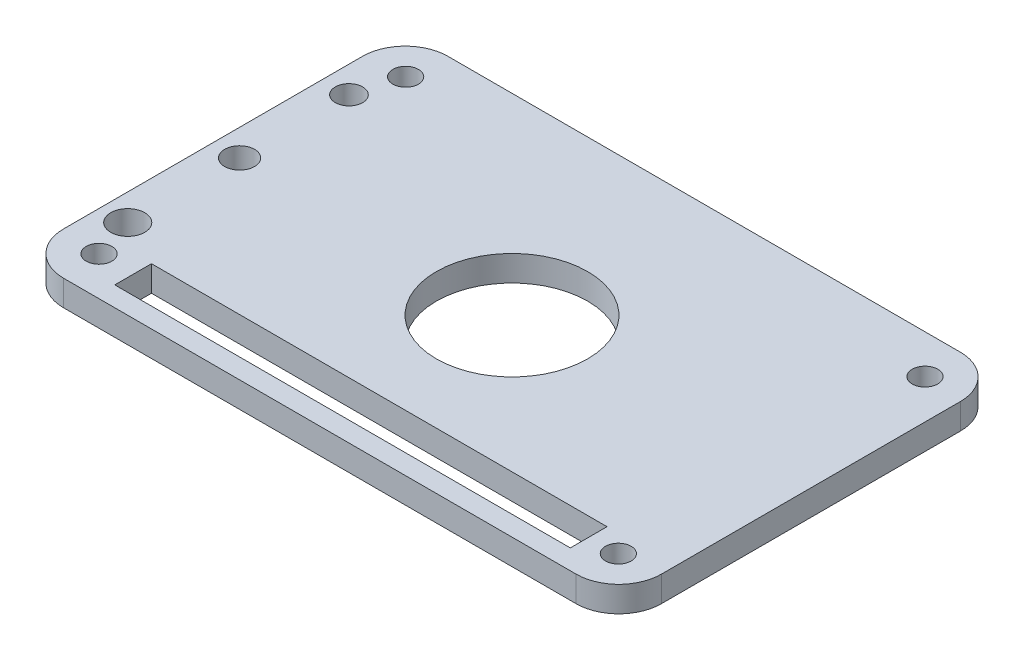
ISO-10303-21;
HEADER;
FILE_DESCRIPTION(('STEP AP214'),'2;1');
FILE_NAME('part.step','',(''),(''),'','','');
FILE_SCHEMA(('AUTOMOTIVE_DESIGN { 1 0 10303 214 1 1 1 1 }'));
ENDSEC;
DATA;
#1=APPLICATION_CONTEXT('core data for automotive mechanical design processes');
#2=APPLICATION_PROTOCOL_DEFINITION('international standard','automotive_design',2000,#1);
#3=PRODUCT_CONTEXT('',#1,'mechanical');
#4=PRODUCT('Part','Part','',(#3));
#5=PRODUCT_RELATED_PRODUCT_CATEGORY('part','',(#4));
#6=PRODUCT_DEFINITION_FORMATION('','',#4);
#7=PRODUCT_DEFINITION_CONTEXT('part definition',#1,'design');
#8=PRODUCT_DEFINITION('design','',#6,#7);
#9=PRODUCT_DEFINITION_SHAPE('','',#8);
#10=(LENGTH_UNIT() NAMED_UNIT(*) SI_UNIT(.MILLI.,.METRE.));
#11=(NAMED_UNIT(*) PLANE_ANGLE_UNIT() SI_UNIT($,.RADIAN.));
#12=(NAMED_UNIT(*) SI_UNIT($,.STERADIAN.) SOLID_ANGLE_UNIT());
#13=UNCERTAINTY_MEASURE_WITH_UNIT(LENGTH_MEASURE(1.E-05),#10,'distance_accuracy_value','');
#14=(GEOMETRIC_REPRESENTATION_CONTEXT(3) GLOBAL_UNCERTAINTY_ASSIGNED_CONTEXT((#13)) GLOBAL_UNIT_ASSIGNED_CONTEXT((#10,
#11,#12)) REPRESENTATION_CONTEXT('',''));
#15=CARTESIAN_POINT('',(0.,0.,0.));
#16=DIRECTION('',(0.,0.,1.));
#17=DIRECTION('',(1.,0.,0.));
#18=AXIS2_PLACEMENT_3D('',#15,#16,#17);
#19=CARTESIAN_POINT('',(-30.,3.,17.5));
#20=DIRECTION('',(0.,1.,0.));
#21=DIRECTION('',(0.,0.,1.));
#22=AXIS2_PLACEMENT_3D('',#19,#20,#21);
#23=PLANE('',#22);
#24=DIRECTION('',(0.,0.,-1.));
#25=VECTOR('',#24,1.);
#26=CARTESIAN_POINT('',(27.006855362046,3.,15.8797292003091));
#27=LINE('',#26,#25);
#28=CARTESIAN_POINT('',(27.006855362046,3.,20.179703378065));
#29=VERTEX_POINT('',#28);
#30=CARTESIAN_POINT('',(27.006855362046,3.,15.8797292003091));
#31=VERTEX_POINT('',#30);
#32=EDGE_CURVE('E62',#29,#31,#27,.T.);
#33=ORIENTED_EDGE('',*,*,#32,.F.);
#34=DIRECTION('',(1.,0.,0.));
#35=VECTOR('',#34,1.);
#36=CARTESIAN_POINT('',(27.006855362046,3.,20.179703378065));
#37=LINE('',#36,#35);
#38=CARTESIAN_POINT('',(-26.3279120708214,3.,20.179703378065));
#39=VERTEX_POINT('',#38);
#40=EDGE_CURVE('E146',#39,#29,#37,.T.);
#41=ORIENTED_EDGE('',*,*,#40,.F.);
#42=DIRECTION('',(0.,0.,1.));
#43=VECTOR('',#42,1.);
#44=CARTESIAN_POINT('',(-26.3279120708214,3.,15.8797292003091));
#45=LINE('',#44,#43);
#46=CARTESIAN_POINT('',(-26.3279120708214,3.,15.8797292003091));
#47=VERTEX_POINT('',#46);
#48=EDGE_CURVE('E151',#47,#39,#45,.T.);
#49=ORIENTED_EDGE('',*,*,#48,.F.);
#50=DIRECTION('',(-1.,0.,0.));
#51=VECTOR('',#50,1.);
#52=CARTESIAN_POINT('',(27.006855362046,3.,15.8797292003091));
#53=LINE('',#52,#51);
#54=EDGE_CURVE('E156',#31,#47,#53,.T.);
#55=ORIENTED_EDGE('',*,*,#54,.F.);
#56=EDGE_LOOP('',(#33,#41,#49,#55));
#57=FACE_BOUND('',#56,.T.);
#58=CARTESIAN_POINT('',(-31.8929936177881,3.,-12.8051895817142));
#59=DIRECTION('',(0.,1.,0.));
#60=DIRECTION('',(0.,0.,1.));
#61=AXIS2_PLACEMENT_3D('',#58,#59,#60);
#62=CIRCLE('',#61,1.60028468422017);
#63=CARTESIAN_POINT('',(-31.8929936177881,3.,-11.204904897494));
#64=VERTEX_POINT('',#63);
#65=EDGE_CURVE('E143',#64,#64,#62,.T.);
#66=ORIENTED_EDGE('',*,*,#65,.F.);
#67=EDGE_LOOP('',(#66));
#68=FACE_BOUND('',#67,.T.);
#69=CARTESIAN_POINT('',(-31.8929936177881,3.,0.));
#70=DIRECTION('',(0.,1.,0.));
#71=DIRECTION('',(0.,0.,1.));
#72=AXIS2_PLACEMENT_3D('',#69,#70,#71);
#73=CIRCLE('',#72,1.75018118663529);
#74=CARTESIAN_POINT('',(-31.8929936177881,3.,1.75018118663529));
#75=VERTEX_POINT('',#74);
#76=EDGE_CURVE('E178',#75,#75,#73,.T.);
#77=ORIENTED_EDGE('',*,*,#76,.F.);
#78=EDGE_LOOP('',(#77));
#79=FACE_BOUND('',#78,.T.);
#80=CARTESIAN_POINT('',(-31.8929936177881,3.,13.0948104182858));
#81=DIRECTION('',(0.,1.,0.));
#82=DIRECTION('',(0.,0.,1.));
#83=AXIS2_PLACEMENT_3D('',#80,#81,#82);
#84=CIRCLE('',#83,1.9930523365173);
#85=CARTESIAN_POINT('',(-31.8929936177881,3.,15.0878627548031));
#86=VERTEX_POINT('',#85);
#87=EDGE_CURVE('E386',#86,#86,#84,.T.);
#88=ORIENTED_EDGE('',*,*,#87,.F.);
#89=EDGE_LOOP('',(#88));
#90=FACE_BOUND('',#89,.T.);
#91=CARTESIAN_POINT('',(0.,3.,0.));
#92=DIRECTION('',(0.,1.,0.));
#93=DIRECTION('',(0.,0.,1.));
#94=AXIS2_PLACEMENT_3D('',#91,#92,#93);
#95=CIRCLE('',#94,8.8562741855178);
#96=CARTESIAN_POINT('',(0.,3.,8.8562741855178));
#97=VERTEX_POINT('',#96);
#98=EDGE_CURVE('E157',#97,#97,#95,.T.);
#99=ORIENTED_EDGE('',*,*,#98,.F.);
#100=EDGE_LOOP('',(#99));
#101=FACE_BOUND('',#100,.T.);
#102=CARTESIAN_POINT('',(30.4,3.,-17.95));
#103=DIRECTION('',(0.,1.,0.));
#104=DIRECTION('',(0.,0.,1.));
#105=AXIS2_PLACEMENT_3D('',#102,#103,#104);
#106=CIRCLE('',#105,1.5);
#107=CARTESIAN_POINT('',(30.4,3.,-16.45));
#108=VERTEX_POINT('',#107);
#109=EDGE_CURVE('E188',#108,#108,#106,.T.);
#110=ORIENTED_EDGE('',*,*,#109,.F.);
#111=EDGE_LOOP('',(#110));
#112=FACE_BOUND('',#111,.T.);
#113=CARTESIAN_POINT('',(-30.4,3.,17.95));
#114=DIRECTION('',(0.,1.,0.));
#115=DIRECTION('',(0.,0.,1.));
#116=AXIS2_PLACEMENT_3D('',#113,#114,#115);
#117=CIRCLE('',#116,1.5);
#118=CARTESIAN_POINT('',(-30.4,3.,19.45));
#119=VERTEX_POINT('',#118);
#120=EDGE_CURVE('E200',#119,#119,#117,.T.);
#121=ORIENTED_EDGE('',*,*,#120,.F.);
#122=EDGE_LOOP('',(#121));
#123=FACE_BOUND('',#122,.T.);
#124=CARTESIAN_POINT('',(-30.,3.,17.5));
#125=DIRECTION('',(0.,1.,0.));
#126=DIRECTION('',(0.,0.,1.));
#127=AXIS2_PLACEMENT_3D('',#124,#125,#126);
#128=CIRCLE('',#127,5.);
#129=CARTESIAN_POINT('',(-35.,3.,17.5));
#130=VERTEX_POINT('',#129);
#131=CARTESIAN_POINT('',(-30.,3.,22.5));
#132=VERTEX_POINT('',#131);
#133=EDGE_CURVE('E206',#130,#132,#128,.T.);
#134=ORIENTED_EDGE('',*,*,#133,.T.);
#135=DIRECTION('',(1.,0.,0.));
#136=VECTOR('',#135,1.);
#137=CARTESIAN_POINT('',(-30.,3.,22.5));
#138=LINE('',#137,#136);
#139=CARTESIAN_POINT('',(29.9999999999999,3.,22.5));
#140=VERTEX_POINT('',#139);
#141=EDGE_CURVE('E209',#132,#140,#138,.T.);
#142=ORIENTED_EDGE('',*,*,#141,.T.);
#143=CARTESIAN_POINT('',(30.,3.,17.5));
#144=DIRECTION('',(0.,1.,0.));
#145=DIRECTION('',(0.,0.,1.));
#146=AXIS2_PLACEMENT_3D('',#143,#144,#145);
#147=CIRCLE('',#146,5.);
#148=CARTESIAN_POINT('',(35.,3.,17.5));
#149=VERTEX_POINT('',#148);
#150=EDGE_CURVE('E212',#140,#149,#147,.T.);
#151=ORIENTED_EDGE('',*,*,#150,.T.);
#152=DIRECTION('',(0.,0.,-1.));
#153=VECTOR('',#152,1.);
#154=CARTESIAN_POINT('',(35.,3.,-17.5));
#155=LINE('',#154,#153);
#156=CARTESIAN_POINT('',(35.,3.,-17.5));
#157=VERTEX_POINT('',#156);
#158=EDGE_CURVE('E214',#149,#157,#155,.T.);
#159=ORIENTED_EDGE('',*,*,#158,.T.);
#160=CARTESIAN_POINT('',(30.,3.,-17.5));
#161=DIRECTION('',(0.,1.,0.));
#162=DIRECTION('',(0.,0.,-1.));
#163=AXIS2_PLACEMENT_3D('',#160,#161,#162);
#164=CIRCLE('',#163,5.);
#165=CARTESIAN_POINT('',(29.9999999999999,3.,-22.5));
#166=VERTEX_POINT('',#165);
#167=EDGE_CURVE('E216',#157,#166,#164,.T.);
#168=ORIENTED_EDGE('',*,*,#167,.T.);
#169=DIRECTION('',(-1.,0.,0.));
#170=VECTOR('',#169,1.);
#171=CARTESIAN_POINT('',(-30.,3.,-22.5));
#172=LINE('',#171,#170);
#173=CARTESIAN_POINT('',(-30.,3.,-22.5));
#174=VERTEX_POINT('',#173);
#175=EDGE_CURVE('E218',#166,#174,#172,.T.);
#176=ORIENTED_EDGE('',*,*,#175,.T.);
#177=CARTESIAN_POINT('',(-30.,3.,-17.5));
#178=DIRECTION('',(0.,1.,0.));
#179=DIRECTION('',(0.,0.,1.));
#180=AXIS2_PLACEMENT_3D('',#177,#178,#179);
#181=CIRCLE('',#180,5.);
#182=CARTESIAN_POINT('',(-35.,3.,-17.5));
#183=VERTEX_POINT('',#182);
#184=EDGE_CURVE('E220',#174,#183,#181,.T.);
#185=ORIENTED_EDGE('',*,*,#184,.T.);
#186=DIRECTION('',(0.,0.,1.));
#187=VECTOR('',#186,1.);
#188=CARTESIAN_POINT('',(-35.,3.,-17.5));
#189=LINE('',#188,#187);
#190=EDGE_CURVE('E222',#183,#130,#189,.T.);
#191=ORIENTED_EDGE('',*,*,#190,.T.);
#192=EDGE_LOOP('',(#134,#142,#151,#159,#168,#176,#185,#191));
#193=FACE_BOUND('',#192,.T.);
#194=CARTESIAN_POINT('',(30.4,3.,17.95));
#195=DIRECTION('',(0.,1.,0.));
#196=DIRECTION('',(0.,0.,-1.));
#197=AXIS2_PLACEMENT_3D('',#194,#195,#196);
#198=CIRCLE('',#197,1.50000000000001);
#199=CARTESIAN_POINT('',(30.4,3.,16.45));
#200=VERTEX_POINT('',#199);
#201=EDGE_CURVE('E194',#200,#200,#198,.T.);
#202=ORIENTED_EDGE('',*,*,#201,.F.);
#203=EDGE_LOOP('',(#202));
#204=FACE_BOUND('',#203,.T.);
#205=CARTESIAN_POINT('',(-30.4,3.,-17.95));
#206=DIRECTION('',(0.,1.,0.));
#207=DIRECTION('',(0.,0.,-1.));
#208=AXIS2_PLACEMENT_3D('',#205,#206,#207);
#209=CIRCLE('',#208,1.5);
#210=CARTESIAN_POINT('',(-30.4,3.,-19.45));
#211=VERTEX_POINT('',#210);
#212=EDGE_CURVE('E182',#211,#211,#209,.T.);
#213=ORIENTED_EDGE('',*,*,#212,.F.);
#214=EDGE_LOOP('',(#213));
#215=FACE_BOUND('',#214,.T.);
#216=ADVANCED_FACE('F47',(#57,#68,#79,#90,#101,#112,#123,#193,#204,#215),#23,.T.);
#217=CARTESIAN_POINT('',(-30.,0.,17.5));
#218=DIRECTION('',(0.,1.,0.));
#219=DIRECTION('',(0.,0.,1.));
#220=AXIS2_PLACEMENT_3D('',#217,#218,#219);
#221=PLANE('',#220);
#222=DIRECTION('',(1.,0.,0.));
#223=VECTOR('',#222,1.);
#224=CARTESIAN_POINT('',(27.006855362046,0.,20.179703378065));
#225=LINE('',#224,#223);
#226=CARTESIAN_POINT('',(-26.3279120708214,0.,20.179703378065));
#227=VERTEX_POINT('',#226);
#228=CARTESIAN_POINT('',(27.006855362046,0.,20.179703378065));
#229=VERTEX_POINT('',#228);
#230=EDGE_CURVE('E165',#227,#229,#225,.T.);
#231=ORIENTED_EDGE('',*,*,#230,.T.);
#232=DIRECTION('',(0.,0.,-1.));
#233=VECTOR('',#232,1.);
#234=CARTESIAN_POINT('',(27.006855362046,0.,15.8797292003091));
#235=LINE('',#234,#233);
#236=CARTESIAN_POINT('',(27.006855362046,0.,15.8797292003091));
#237=VERTEX_POINT('',#236);
#238=EDGE_CURVE('E138',#229,#237,#235,.T.);
#239=ORIENTED_EDGE('',*,*,#238,.T.);
#240=DIRECTION('',(-1.,0.,0.));
#241=VECTOR('',#240,1.);
#242=CARTESIAN_POINT('',(27.006855362046,0.,15.8797292003091));
#243=LINE('',#242,#241);
#244=CARTESIAN_POINT('',(-26.3279120708214,0.,15.8797292003091));
#245=VERTEX_POINT('',#244);
#246=EDGE_CURVE('E169',#237,#245,#243,.T.);
#247=ORIENTED_EDGE('',*,*,#246,.T.);
#248=DIRECTION('',(0.,0.,1.));
#249=VECTOR('',#248,1.);
#250=CARTESIAN_POINT('',(-26.3279120708214,0.,15.8797292003091));
#251=LINE('',#250,#249);
#252=EDGE_CURVE('E70',#245,#227,#251,.T.);
#253=ORIENTED_EDGE('',*,*,#252,.T.);
#254=EDGE_LOOP('',(#231,#239,#247,#253));
#255=FACE_BOUND('',#254,.T.);
#256=CARTESIAN_POINT('',(-31.8929936177881,0.,-12.8051895817142));
#257=DIRECTION('',(0.,1.,0.));
#258=DIRECTION('',(0.,0.,1.));
#259=AXIS2_PLACEMENT_3D('',#256,#257,#258);
#260=CIRCLE('',#259,1.60028468422017);
#261=CARTESIAN_POINT('',(-31.8929936177881,0.,-11.204904897494));
#262=VERTEX_POINT('',#261);
#263=EDGE_CURVE('E175',#262,#262,#260,.T.);
#264=ORIENTED_EDGE('',*,*,#263,.T.);
#265=EDGE_LOOP('',(#264));
#266=FACE_BOUND('',#265,.T.);
#267=CARTESIAN_POINT('',(-31.8929936177881,0.,0.));
#268=DIRECTION('',(0.,1.,0.));
#269=DIRECTION('',(0.,0.,1.));
#270=AXIS2_PLACEMENT_3D('',#267,#268,#269);
#271=CIRCLE('',#270,1.75018118663529);
#272=CARTESIAN_POINT('',(-31.8929936177881,0.,1.75018118663529));
#273=VERTEX_POINT('',#272);
#274=EDGE_CURVE('E381',#273,#273,#271,.T.);
#275=ORIENTED_EDGE('',*,*,#274,.T.);
#276=EDGE_LOOP('',(#275));
#277=FACE_BOUND('',#276,.T.);
#278=CARTESIAN_POINT('',(-31.8929936177881,0.,13.0948104182858));
#279=DIRECTION('',(0.,1.,0.));
#280=DIRECTION('',(0.,0.,1.));
#281=AXIS2_PLACEMENT_3D('',#278,#279,#280);
#282=CIRCLE('',#281,1.9930523365173);
#283=CARTESIAN_POINT('',(-31.8929936177881,0.,15.0878627548031));
#284=VERTEX_POINT('',#283);
#285=EDGE_CURVE('E391',#284,#284,#282,.T.);
#286=ORIENTED_EDGE('',*,*,#285,.T.);
#287=EDGE_LOOP('',(#286));
#288=FACE_BOUND('',#287,.T.);
#289=CARTESIAN_POINT('',(0.,0.,0.));
#290=DIRECTION('',(0.,1.,0.));
#291=DIRECTION('',(0.,0.,1.));
#292=AXIS2_PLACEMENT_3D('',#289,#290,#291);
#293=CIRCLE('',#292,8.8562741855178);
#294=CARTESIAN_POINT('',(0.,0.,8.8562741855178));
#295=VERTEX_POINT('',#294);
#296=EDGE_CURVE('E160',#295,#295,#293,.T.);
#297=ORIENTED_EDGE('',*,*,#296,.T.);
#298=EDGE_LOOP('',(#297));
#299=FACE_BOUND('',#298,.T.);
#300=CARTESIAN_POINT('',(-30.,0.,17.5));
#301=DIRECTION('',(0.,1.,0.));
#302=DIRECTION('',(0.,0.,1.));
#303=AXIS2_PLACEMENT_3D('',#300,#301,#302);
#304=CIRCLE('',#303,5.);
#305=CARTESIAN_POINT('',(-35.,0.,17.5));
#306=VERTEX_POINT('',#305);
#307=CARTESIAN_POINT('',(-30.,0.,22.5));
#308=VERTEX_POINT('',#307);
#309=EDGE_CURVE('E203',#306,#308,#304,.T.);
#310=ORIENTED_EDGE('',*,*,#309,.F.);
#311=DIRECTION('',(0.,0.,1.));
#312=VECTOR('',#311,1.);
#313=CARTESIAN_POINT('',(-35.,0.,-17.5));
#314=LINE('',#313,#312);
#315=CARTESIAN_POINT('',(-35.,0.,-17.5));
#316=VERTEX_POINT('',#315);
#317=EDGE_CURVE('E210',#316,#306,#314,.T.);
#318=ORIENTED_EDGE('',*,*,#317,.F.);
#319=CARTESIAN_POINT('',(-30.,0.,-17.5));
#320=DIRECTION('',(0.,1.,0.));
#321=DIRECTION('',(0.,0.,1.));
#322=AXIS2_PLACEMENT_3D('',#319,#320,#321);
#323=CIRCLE('',#322,5.);
#324=CARTESIAN_POINT('',(-30.,0.,-22.5));
#325=VERTEX_POINT('',#324);
#326=EDGE_CURVE('E237',#325,#316,#323,.T.);
#327=ORIENTED_EDGE('',*,*,#326,.F.);
#328=DIRECTION('',(-1.,0.,0.));
#329=VECTOR('',#328,1.);
#330=CARTESIAN_POINT('',(-30.,0.,-22.5));
#331=LINE('',#330,#329);
#332=CARTESIAN_POINT('',(29.9999999999999,0.,-22.5));
#333=VERTEX_POINT('',#332);
#334=EDGE_CURVE('E235',#333,#325,#331,.T.);
#335=ORIENTED_EDGE('',*,*,#334,.F.);
#336=CARTESIAN_POINT('',(30.,0.,-17.5));
#337=DIRECTION('',(0.,1.,0.));
#338=DIRECTION('',(0.,0.,-1.));
#339=AXIS2_PLACEMENT_3D('',#336,#337,#338);
#340=CIRCLE('',#339,5.);
#341=CARTESIAN_POINT('',(35.,0.,-17.5));
#342=VERTEX_POINT('',#341);
#343=EDGE_CURVE('E233',#342,#333,#340,.T.);
#344=ORIENTED_EDGE('',*,*,#343,.F.);
#345=DIRECTION('',(0.,0.,-1.));
#346=VECTOR('',#345,1.);
#347=CARTESIAN_POINT('',(35.,0.,-17.5));
#348=LINE('',#347,#346);
#349=CARTESIAN_POINT('',(35.,0.,17.5));
#350=VERTEX_POINT('',#349);
#351=EDGE_CURVE('E231',#350,#342,#348,.T.);
#352=ORIENTED_EDGE('',*,*,#351,.F.);
#353=CARTESIAN_POINT('',(30.,0.,17.5));
#354=DIRECTION('',(0.,1.,0.));
#355=DIRECTION('',(0.,0.,1.));
#356=AXIS2_PLACEMENT_3D('',#353,#354,#355);
#357=CIRCLE('',#356,5.);
#358=CARTESIAN_POINT('',(29.9999999999999,0.,22.5));
#359=VERTEX_POINT('',#358);
#360=EDGE_CURVE('E229',#359,#350,#357,.T.);
#361=ORIENTED_EDGE('',*,*,#360,.F.);
#362=DIRECTION('',(1.,0.,0.));
#363=VECTOR('',#362,1.);
#364=CARTESIAN_POINT('',(-30.,0.,22.5));
#365=LINE('',#364,#363);
#366=EDGE_CURVE('E227',#308,#359,#365,.T.);
#367=ORIENTED_EDGE('',*,*,#366,.F.);
#368=EDGE_LOOP('',(#310,#318,#327,#335,#344,#352,#361,#367));
#369=FACE_BOUND('',#368,.T.);
#370=CARTESIAN_POINT('',(-30.4,0.,17.95));
#371=DIRECTION('',(0.,1.,0.));
#372=DIRECTION('',(0.,0.,1.));
#373=AXIS2_PLACEMENT_3D('',#370,#371,#372);
#374=CIRCLE('',#373,1.5);
#375=CARTESIAN_POINT('',(-30.4,0.,19.45));
#376=VERTEX_POINT('',#375);
#377=EDGE_CURVE('E197',#376,#376,#374,.T.);
#378=ORIENTED_EDGE('',*,*,#377,.T.);
#379=EDGE_LOOP('',(#378));
#380=FACE_BOUND('',#379,.T.);
#381=CARTESIAN_POINT('',(30.4,0.,17.95));
#382=DIRECTION('',(0.,1.,0.));
#383=DIRECTION('',(0.,0.,-1.));
#384=AXIS2_PLACEMENT_3D('',#381,#382,#383);
#385=CIRCLE('',#384,1.50000000000001);
#386=CARTESIAN_POINT('',(30.4,0.,16.45));
#387=VERTEX_POINT('',#386);
#388=EDGE_CURVE('E191',#387,#387,#385,.T.);
#389=ORIENTED_EDGE('',*,*,#388,.T.);
#390=EDGE_LOOP('',(#389));
#391=FACE_BOUND('',#390,.T.);
#392=CARTESIAN_POINT('',(30.4,0.,-17.95));
#393=DIRECTION('',(0.,1.,0.));
#394=DIRECTION('',(0.,0.,1.));
#395=AXIS2_PLACEMENT_3D('',#392,#393,#394);
#396=CIRCLE('',#395,1.5);
#397=CARTESIAN_POINT('',(30.4,0.,-16.45));
#398=VERTEX_POINT('',#397);
#399=EDGE_CURVE('E185',#398,#398,#396,.T.);
#400=ORIENTED_EDGE('',*,*,#399,.T.);
#401=EDGE_LOOP('',(#400));
#402=FACE_BOUND('',#401,.T.);
#403=CARTESIAN_POINT('',(-30.4,0.,-17.95));
#404=DIRECTION('',(0.,1.,0.));
#405=DIRECTION('',(0.,0.,-1.));
#406=AXIS2_PLACEMENT_3D('',#403,#404,#405);
#407=CIRCLE('',#406,1.5);
#408=CARTESIAN_POINT('',(-30.4,0.,-19.45));
#409=VERTEX_POINT('',#408);
#410=EDGE_CURVE('E180',#409,#409,#407,.T.);
#411=ORIENTED_EDGE('',*,*,#410,.T.);
#412=EDGE_LOOP('',(#411));
#413=FACE_BOUND('',#412,.T.);
#414=ADVANCED_FACE('F267',(#255,#266,#277,#288,#299,#369,#380,#391,#402,#413),#221,.F.);
#415=CARTESIAN_POINT('',(-30.,3.,17.5));
#416=DIRECTION('',(0.,-1.,0.));
#417=DIRECTION('',(0.,0.,-1.));
#418=AXIS2_PLACEMENT_3D('',#415,#416,#417);
#419=CYLINDRICAL_SURFACE('',#418,5.);
#420=ORIENTED_EDGE('',*,*,#309,.T.);
#421=DIRECTION('',(0.,-1.,0.));
#422=VECTOR('',#421,1.);
#423=CARTESIAN_POINT('',(-30.,3.,22.5));
#424=LINE('',#423,#422);
#425=EDGE_CURVE('E11',#132,#308,#424,.T.);
#426=ORIENTED_EDGE('',*,*,#425,.F.);
#427=ORIENTED_EDGE('',*,*,#133,.F.);
#428=DIRECTION('',(0.,-1.,0.));
#429=VECTOR('',#428,1.);
#430=CARTESIAN_POINT('',(-35.,3.,17.5));
#431=LINE('',#430,#429);
#432=EDGE_CURVE('E224',#130,#306,#431,.T.);
#433=ORIENTED_EDGE('',*,*,#432,.T.);
#434=EDGE_LOOP('',(#420,#426,#427,#433));
#435=FACE_BOUND('',#434,.T.);
#436=ADVANCED_FACE('F49',(#435),#419,.T.);
#437=CARTESIAN_POINT('',(-30.,3.,22.5));
#438=DIRECTION('',(0.,0.,-1.));
#439=DIRECTION('',(-1.,0.,0.));
#440=AXIS2_PLACEMENT_3D('',#437,#438,#439);
#441=PLANE('',#440);
#442=ORIENTED_EDGE('',*,*,#366,.T.);
#443=DIRECTION('',(0.,-1.,0.));
#444=VECTOR('',#443,1.);
#445=CARTESIAN_POINT('',(29.9999999999999,3.,22.5));
#446=LINE('',#445,#444);
#447=EDGE_CURVE('E55',#140,#359,#446,.T.);
#448=ORIENTED_EDGE('',*,*,#447,.F.);
#449=ORIENTED_EDGE('',*,*,#141,.F.);
#450=ORIENTED_EDGE('',*,*,#425,.T.);
#451=EDGE_LOOP('',(#442,#448,#449,#450));
#452=FACE_BOUND('',#451,.T.);
#453=ADVANCED_FACE('F285',(#452),#441,.F.);
#454=CARTESIAN_POINT('',(30.,3.,17.5));
#455=DIRECTION('',(0.,-1.,0.));
#456=DIRECTION('',(0.,0.,-1.));
#457=AXIS2_PLACEMENT_3D('',#454,#455,#456);
#458=CYLINDRICAL_SURFACE('',#457,5.);
#459=ORIENTED_EDGE('',*,*,#360,.T.);
#460=DIRECTION('',(0.,-1.,0.));
#461=VECTOR('',#460,1.);
#462=CARTESIAN_POINT('',(35.,3.,17.5));
#463=LINE('',#462,#461);
#464=EDGE_CURVE('E254',#149,#350,#463,.T.);
#465=ORIENTED_EDGE('',*,*,#464,.F.);
#466=ORIENTED_EDGE('',*,*,#150,.F.);
#467=ORIENTED_EDGE('',*,*,#447,.T.);
#468=EDGE_LOOP('',(#459,#465,#466,#467));
#469=FACE_BOUND('',#468,.T.);
#470=ADVANCED_FACE('F261',(#469),#458,.T.);
#471=CARTESIAN_POINT('',(35.,3.,-17.5));
#472=DIRECTION('',(-1.,0.,0.));
#473=DIRECTION('',(0.,0.,1.));
#474=AXIS2_PLACEMENT_3D('',#471,#472,#473);
#475=PLANE('',#474);
#476=ORIENTED_EDGE('',*,*,#351,.T.);
#477=DIRECTION('',(0.,-1.,0.));
#478=VECTOR('',#477,1.);
#479=CARTESIAN_POINT('',(35.,3.,-17.5));
#480=LINE('',#479,#478);
#481=EDGE_CURVE('E251',#157,#342,#480,.T.);
#482=ORIENTED_EDGE('',*,*,#481,.F.);
#483=ORIENTED_EDGE('',*,*,#158,.F.);
#484=ORIENTED_EDGE('',*,*,#464,.T.);
#485=EDGE_LOOP('',(#476,#482,#483,#484));
#486=FACE_BOUND('',#485,.T.);
#487=ADVANCED_FACE('F273',(#486),#475,.F.);
#488=CARTESIAN_POINT('',(30.,3.,-17.5));
#489=DIRECTION('',(0.,-1.,0.));
#490=DIRECTION('',(0.,0.,-1.));
#491=AXIS2_PLACEMENT_3D('',#488,#489,#490);
#492=CYLINDRICAL_SURFACE('',#491,5.);
#493=ORIENTED_EDGE('',*,*,#343,.T.);
#494=DIRECTION('',(0.,-1.,0.));
#495=VECTOR('',#494,1.);
#496=CARTESIAN_POINT('',(29.9999999999999,3.,-22.5));
#497=LINE('',#496,#495);
#498=EDGE_CURVE('E248',#166,#333,#497,.T.);
#499=ORIENTED_EDGE('',*,*,#498,.F.);
#500=ORIENTED_EDGE('',*,*,#167,.F.);
#501=ORIENTED_EDGE('',*,*,#481,.T.);
#502=EDGE_LOOP('',(#493,#499,#500,#501));
#503=FACE_BOUND('',#502,.T.);
#504=ADVANCED_FACE('F277',(#503),#492,.T.);
#505=CARTESIAN_POINT('',(-30.,3.,-22.5));
#506=DIRECTION('',(0.,0.,1.));
#507=DIRECTION('',(1.,0.,0.));
#508=AXIS2_PLACEMENT_3D('',#505,#506,#507);
#509=PLANE('',#508);
#510=ORIENTED_EDGE('',*,*,#334,.T.);
#511=DIRECTION('',(0.,-1.,0.));
#512=VECTOR('',#511,1.);
#513=CARTESIAN_POINT('',(-30.,3.,-22.5));
#514=LINE('',#513,#512);
#515=EDGE_CURVE('E245',#174,#325,#514,.T.);
#516=ORIENTED_EDGE('',*,*,#515,.F.);
#517=ORIENTED_EDGE('',*,*,#175,.F.);
#518=ORIENTED_EDGE('',*,*,#498,.T.);
#519=EDGE_LOOP('',(#510,#516,#517,#518));
#520=FACE_BOUND('',#519,.T.);
#521=ADVANCED_FACE('F298',(#520),#509,.F.);
#522=CARTESIAN_POINT('',(-30.,3.,-17.5));
#523=DIRECTION('',(0.,-1.,0.));
#524=DIRECTION('',(0.,0.,-1.));
#525=AXIS2_PLACEMENT_3D('',#522,#523,#524);
#526=CYLINDRICAL_SURFACE('',#525,5.);
#527=ORIENTED_EDGE('',*,*,#326,.T.);
#528=DIRECTION('',(0.,-1.,0.));
#529=VECTOR('',#528,1.);
#530=CARTESIAN_POINT('',(-35.,3.,-17.5));
#531=LINE('',#530,#529);
#532=EDGE_CURVE('E242',#183,#316,#531,.T.);
#533=ORIENTED_EDGE('',*,*,#532,.F.);
#534=ORIENTED_EDGE('',*,*,#184,.F.);
#535=ORIENTED_EDGE('',*,*,#515,.T.);
#536=EDGE_LOOP('',(#527,#533,#534,#535));
#537=FACE_BOUND('',#536,.T.);
#538=ADVANCED_FACE('F296',(#537),#526,.T.);
#539=CARTESIAN_POINT('',(-35.,3.,-17.5));
#540=DIRECTION('',(1.,0.,0.));
#541=DIRECTION('',(0.,0.,-1.));
#542=AXIS2_PLACEMENT_3D('',#539,#540,#541);
#543=PLANE('',#542);
#544=ORIENTED_EDGE('',*,*,#317,.T.);
#545=ORIENTED_EDGE('',*,*,#432,.F.);
#546=ORIENTED_EDGE('',*,*,#190,.F.);
#547=ORIENTED_EDGE('',*,*,#532,.T.);
#548=EDGE_LOOP('',(#544,#545,#546,#547));
#549=FACE_BOUND('',#548,.T.);
#550=ADVANCED_FACE('F291',(#549),#543,.F.);
#551=CARTESIAN_POINT('',(-30.4,3.,17.95));
#552=DIRECTION('',(0.,-1.,0.));
#553=DIRECTION('',(0.,0.,-1.));
#554=AXIS2_PLACEMENT_3D('',#551,#552,#553);
#555=CYLINDRICAL_SURFACE('',#554,1.5);
#556=ORIENTED_EDGE('',*,*,#120,.T.);
#557=EDGE_LOOP('',(#556));
#558=FACE_BOUND('',#557,.T.);
#559=ORIENTED_EDGE('',*,*,#377,.F.);
#560=EDGE_LOOP('',(#559));
#561=FACE_BOUND('',#560,.T.);
#562=ADVANCED_FACE('F315',(#558,#561),#555,.F.);
#563=CARTESIAN_POINT('',(30.4,3.,17.95));
#564=DIRECTION('',(0.,-1.,0.));
#565=DIRECTION('',(0.,0.,-1.));
#566=AXIS2_PLACEMENT_3D('',#563,#564,#565);
#567=CYLINDRICAL_SURFACE('',#566,1.50000000000001);
#568=ORIENTED_EDGE('',*,*,#201,.T.);
#569=EDGE_LOOP('',(#568));
#570=FACE_BOUND('',#569,.T.);
#571=ORIENTED_EDGE('',*,*,#388,.F.);
#572=EDGE_LOOP('',(#571));
#573=FACE_BOUND('',#572,.T.);
#574=ADVANCED_FACE('F322',(#570,#573),#567,.F.);
#575=CARTESIAN_POINT('',(30.4,3.,-17.95));
#576=DIRECTION('',(0.,-1.,0.));
#577=DIRECTION('',(0.,0.,-1.));
#578=AXIS2_PLACEMENT_3D('',#575,#576,#577);
#579=CYLINDRICAL_SURFACE('',#578,1.5);
#580=ORIENTED_EDGE('',*,*,#109,.T.);
#581=EDGE_LOOP('',(#580));
#582=FACE_BOUND('',#581,.T.);
#583=ORIENTED_EDGE('',*,*,#399,.F.);
#584=EDGE_LOOP('',(#583));
#585=FACE_BOUND('',#584,.T.);
#586=ADVANCED_FACE('F327',(#582,#585),#579,.F.);
#587=CARTESIAN_POINT('',(-30.4,3.,-17.95));
#588=DIRECTION('',(0.,-1.,0.));
#589=DIRECTION('',(0.,0.,-1.));
#590=AXIS2_PLACEMENT_3D('',#587,#588,#589);
#591=CYLINDRICAL_SURFACE('',#590,1.5);
#592=ORIENTED_EDGE('',*,*,#212,.T.);
#593=EDGE_LOOP('',(#592));
#594=FACE_BOUND('',#593,.T.);
#595=ORIENTED_EDGE('',*,*,#410,.F.);
#596=EDGE_LOOP('',(#595));
#597=FACE_BOUND('',#596,.T.);
#598=ADVANCED_FACE('F339',(#594,#597),#591,.F.);
#599=CARTESIAN_POINT('',(0.,0.,0.));
#600=DIRECTION('',(0.,1.,0.));
#601=DIRECTION('',(0.,0.,1.));
#602=AXIS2_PLACEMENT_3D('',#599,#600,#601);
#603=CYLINDRICAL_SURFACE('',#602,8.8562741855178);
#604=ORIENTED_EDGE('',*,*,#296,.F.);
#605=EDGE_LOOP('',(#604));
#606=FACE_BOUND('',#605,.T.);
#607=ORIENTED_EDGE('',*,*,#98,.T.);
#608=EDGE_LOOP('',(#607));
#609=FACE_BOUND('',#608,.T.);
#610=ADVANCED_FACE('F341',(#606,#609),#603,.F.);
#611=CARTESIAN_POINT('',(-31.8929936177881,0.,13.0948104182858));
#612=DIRECTION('',(0.,1.,0.));
#613=DIRECTION('',(0.,0.,1.));
#614=AXIS2_PLACEMENT_3D('',#611,#612,#613);
#615=CYLINDRICAL_SURFACE('',#614,1.9930523365173);
#616=ORIENTED_EDGE('',*,*,#285,.F.);
#617=EDGE_LOOP('',(#616));
#618=FACE_BOUND('',#617,.T.);
#619=ORIENTED_EDGE('',*,*,#87,.T.);
#620=EDGE_LOOP('',(#619));
#621=FACE_BOUND('',#620,.T.);
#622=ADVANCED_FACE('F349',(#618,#621),#615,.F.);
#623=CARTESIAN_POINT('',(-31.8929936177881,0.,0.));
#624=DIRECTION('',(0.,1.,0.));
#625=DIRECTION('',(0.,0.,1.));
#626=AXIS2_PLACEMENT_3D('',#623,#624,#625);
#627=CYLINDRICAL_SURFACE('',#626,1.75018118663529);
#628=ORIENTED_EDGE('',*,*,#274,.F.);
#629=EDGE_LOOP('',(#628));
#630=FACE_BOUND('',#629,.T.);
#631=ORIENTED_EDGE('',*,*,#76,.T.);
#632=EDGE_LOOP('',(#631));
#633=FACE_BOUND('',#632,.T.);
#634=ADVANCED_FACE('F358',(#630,#633),#627,.F.);
#635=CARTESIAN_POINT('',(-31.8929936177881,0.,-12.8051895817142));
#636=DIRECTION('',(0.,1.,0.));
#637=DIRECTION('',(0.,0.,1.));
#638=AXIS2_PLACEMENT_3D('',#635,#636,#637);
#639=CYLINDRICAL_SURFACE('',#638,1.60028468422017);
#640=ORIENTED_EDGE('',*,*,#263,.F.);
#641=EDGE_LOOP('',(#640));
#642=FACE_BOUND('',#641,.T.);
#643=ORIENTED_EDGE('',*,*,#65,.T.);
#644=EDGE_LOOP('',(#643));
#645=FACE_BOUND('',#644,.T.);
#646=ADVANCED_FACE('F355',(#642,#645),#639,.F.);
#647=CARTESIAN_POINT('',(27.006855362046,0.,15.8797292003091));
#648=DIRECTION('',(1.,0.,0.));
#649=DIRECTION('',(0.,0.,-1.));
#650=AXIS2_PLACEMENT_3D('',#647,#648,#649);
#651=PLANE('',#650);
#652=ORIENTED_EDGE('',*,*,#32,.T.);
#653=DIRECTION('',(0.,1.,0.));
#654=VECTOR('',#653,1.);
#655=CARTESIAN_POINT('',(27.006855362046,0.,15.8797292003091));
#656=LINE('',#655,#654);
#657=EDGE_CURVE('E167',#237,#31,#656,.T.);
#658=ORIENTED_EDGE('',*,*,#657,.F.);
#659=ORIENTED_EDGE('',*,*,#238,.F.);
#660=DIRECTION('',(0.,1.,0.));
#661=VECTOR('',#660,1.);
#662=CARTESIAN_POINT('',(27.006855362046,0.,20.179703378065));
#663=LINE('',#662,#661);
#664=EDGE_CURVE('E134',#229,#29,#663,.T.);
#665=ORIENTED_EDGE('',*,*,#664,.T.);
#666=EDGE_LOOP('',(#652,#658,#659,#665));
#667=FACE_BOUND('',#666,.T.);
#668=ADVANCED_FACE('F136',(#667),#651,.F.);
#669=CARTESIAN_POINT('',(27.006855362046,0.,20.179703378065));
#670=DIRECTION('',(0.,0.,1.));
#671=DIRECTION('',(1.,0.,0.));
#672=AXIS2_PLACEMENT_3D('',#669,#670,#671);
#673=PLANE('',#672);
#674=ORIENTED_EDGE('',*,*,#40,.T.);
#675=ORIENTED_EDGE('',*,*,#664,.F.);
#676=ORIENTED_EDGE('',*,*,#230,.F.);
#677=DIRECTION('',(0.,1.,0.));
#678=VECTOR('',#677,1.);
#679=CARTESIAN_POINT('',(-26.3279120708214,0.,20.179703378065));
#680=LINE('',#679,#678);
#681=EDGE_CURVE('E142',#227,#39,#680,.T.);
#682=ORIENTED_EDGE('',*,*,#681,.T.);
#683=EDGE_LOOP('',(#674,#675,#676,#682));
#684=FACE_BOUND('',#683,.T.);
#685=ADVANCED_FACE('F147',(#684),#673,.F.);
#686=CARTESIAN_POINT('',(-26.3279120708214,0.,15.8797292003091));
#687=DIRECTION('',(-1.,0.,0.));
#688=DIRECTION('',(0.,0.,1.));
#689=AXIS2_PLACEMENT_3D('',#686,#687,#688);
#690=PLANE('',#689);
#691=ORIENTED_EDGE('',*,*,#48,.T.);
#692=ORIENTED_EDGE('',*,*,#681,.F.);
#693=ORIENTED_EDGE('',*,*,#252,.F.);
#694=DIRECTION('',(0.,1.,0.));
#695=VECTOR('',#694,1.);
#696=CARTESIAN_POINT('',(-26.3279120708214,0.,15.8797292003091));
#697=LINE('',#696,#695);
#698=EDGE_CURVE('E395',#245,#47,#697,.T.);
#699=ORIENTED_EDGE('',*,*,#698,.T.);
#700=EDGE_LOOP('',(#691,#692,#693,#699));
#701=FACE_BOUND('',#700,.T.);
#702=ADVANCED_FACE('F362',(#701),#690,.F.);
#703=CARTESIAN_POINT('',(27.006855362046,0.,15.8797292003091));
#704=DIRECTION('',(0.,0.,-1.));
#705=DIRECTION('',(-1.,0.,0.));
#706=AXIS2_PLACEMENT_3D('',#703,#704,#705);
#707=PLANE('',#706);
#708=ORIENTED_EDGE('',*,*,#54,.T.);
#709=ORIENTED_EDGE('',*,*,#698,.F.);
#710=ORIENTED_EDGE('',*,*,#246,.F.);
#711=ORIENTED_EDGE('',*,*,#657,.T.);
#712=EDGE_LOOP('',(#708,#709,#710,#711));
#713=FACE_BOUND('',#712,.T.);
#714=ADVANCED_FACE('F365',(#713),#707,.F.);
#715=CLOSED_SHELL('',(#216,#414,#436,#453,#470,#487,#504,#521,#538,#550,#562,#574,#586,#598,
#610,#622,#634,#646,#668,#685,#702,#714));
#716=MANIFOLD_SOLID_BREP('B2',#715);
#717=ADVANCED_BREP_SHAPE_REPRESENTATION('',(#18,#716),#14);
#718=SHAPE_DEFINITION_REPRESENTATION(#9,#717);
ENDSEC;
END-ISO-10303-21;
